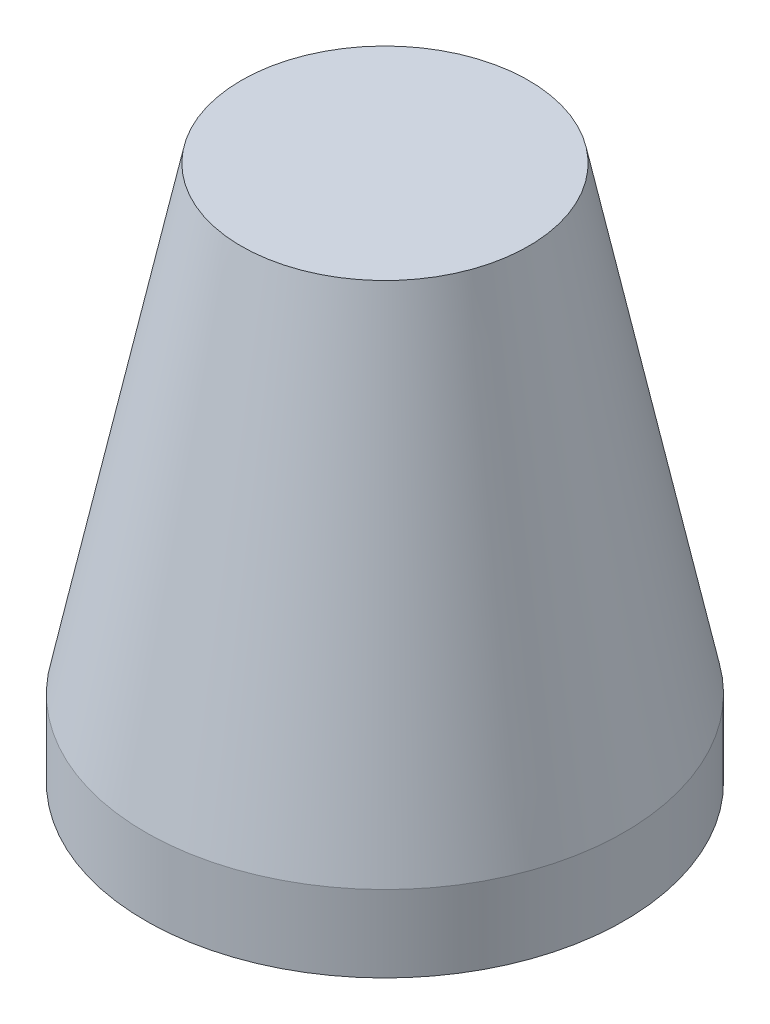
ISO-10303-21;
HEADER;
FILE_DESCRIPTION(('STEP AP214'),'2;1');
FILE_NAME('part.step','',(''),(''),'','','');
FILE_SCHEMA(('AUTOMOTIVE_DESIGN { 1 0 10303 214 1 1 1 1 }'));
ENDSEC;
DATA;
#1=APPLICATION_CONTEXT('core data for automotive mechanical design processes');
#2=APPLICATION_PROTOCOL_DEFINITION('international standard','automotive_design',2000,#1);
#3=PRODUCT_CONTEXT('',#1,'mechanical');
#4=PRODUCT('Part','Part','',(#3));
#5=PRODUCT_RELATED_PRODUCT_CATEGORY('part','',(#4));
#6=PRODUCT_DEFINITION_FORMATION('','',#4);
#7=PRODUCT_DEFINITION_CONTEXT('part definition',#1,'design');
#8=PRODUCT_DEFINITION('design','',#6,#7);
#9=PRODUCT_DEFINITION_SHAPE('','',#8);
#10=(LENGTH_UNIT() NAMED_UNIT(*) SI_UNIT(.MILLI.,.METRE.));
#11=(NAMED_UNIT(*) PLANE_ANGLE_UNIT() SI_UNIT($,.RADIAN.));
#12=(NAMED_UNIT(*) SI_UNIT($,.STERADIAN.) SOLID_ANGLE_UNIT());
#13=UNCERTAINTY_MEASURE_WITH_UNIT(LENGTH_MEASURE(1.E-05),#10,'distance_accuracy_value','');
#14=(GEOMETRIC_REPRESENTATION_CONTEXT(3) GLOBAL_UNCERTAINTY_ASSIGNED_CONTEXT((#13)) GLOBAL_UNIT_ASSIGNED_CONTEXT((#10,
#11,#12)) REPRESENTATION_CONTEXT('',''));
#15=CARTESIAN_POINT('',(0.,0.,0.));
#16=DIRECTION('',(0.,0.,1.));
#17=DIRECTION('',(1.,0.,0.));
#18=AXIS2_PLACEMENT_3D('',#15,#16,#17);
#19=CARTESIAN_POINT('',(-15.,56.,0.));
#20=DIRECTION('',(0.,1.,0.));
#21=DIRECTION('',(-1.,0.,0.));
#22=AXIS2_PLACEMENT_3D('',#19,#20,#21);
#23=PLANE('',#22);
#24=CARTESIAN_POINT('',(0.,56.,0.));
#25=DIRECTION('',(0.,1.,0.));
#26=DIRECTION('',(-1.,0.,0.));
#27=AXIS2_PLACEMENT_3D('',#24,#25,#26);
#28=CIRCLE('',#27,15.);
#29=CARTESIAN_POINT('',(-15.,56.,0.));
#30=VERTEX_POINT('',#29);
#31=EDGE_CURVE('E53',#30,#30,#28,.T.);
#32=ORIENTED_EDGE('',*,*,#31,.T.);
#33=EDGE_LOOP('',(#32));
#34=FACE_BOUND('',#33,.T.);
#35=ADVANCED_FACE('F41',(#34),#23,.T.);
#36=CARTESIAN_POINT('',(0.,0.,0.));
#37=DIRECTION('',(0.,-1.,0.));
#38=DIRECTION('',(1.,0.,0.));
#39=AXIS2_PLACEMENT_3D('',#36,#37,#38);
#40=PLANE('',#39);
#41=CARTESIAN_POINT('',(0.,0.,0.));
#42=DIRECTION('',(0.,1.,0.));
#43=DIRECTION('',(-1.,0.,0.));
#44=AXIS2_PLACEMENT_3D('',#41,#42,#43);
#45=CIRCLE('',#44,25.);
#46=CARTESIAN_POINT('',(-25.,0.,0.));
#47=VERTEX_POINT('',#46);
#48=EDGE_CURVE('E10',#47,#47,#45,.T.);
#49=ORIENTED_EDGE('',*,*,#48,.F.);
#50=EDGE_LOOP('',(#49));
#51=FACE_BOUND('',#50,.T.);
#52=ADVANCED_FACE('F69',(#51),#40,.T.);
#53=CARTESIAN_POINT('',(0.,56.,0.));
#54=DIRECTION('',(0.,1.,0.));
#55=DIRECTION('',(-1.,0.,0.));
#56=AXIS2_PLACEMENT_3D('',#53,#54,#55);
#57=CYLINDRICAL_SURFACE('',#56,25.);
#58=ORIENTED_EDGE('',*,*,#48,.T.);
#59=EDGE_LOOP('',(#58));
#60=FACE_BOUND('',#59,.T.);
#61=CARTESIAN_POINT('',(0.,8.,0.));
#62=DIRECTION('',(0.,1.,0.));
#63=DIRECTION('',(-1.,0.,0.));
#64=AXIS2_PLACEMENT_3D('',#61,#62,#63);
#65=CIRCLE('',#64,25.);
#66=CARTESIAN_POINT('',(-25.,8.,0.));
#67=VERTEX_POINT('',#66);
#68=EDGE_CURVE('E48',#67,#67,#65,.T.);
#69=ORIENTED_EDGE('',*,*,#68,.F.);
#70=EDGE_LOOP('',(#69));
#71=FACE_BOUND('',#70,.T.);
#72=ADVANCED_FACE('F64',(#60,#71),#57,.T.);
#73=CARTESIAN_POINT('',(0.,56.,0.));
#74=DIRECTION('',(0.,-1.,0.));
#75=DIRECTION('',(1.,0.,0.));
#76=AXIS2_PLACEMENT_3D('',#73,#74,#75);
#77=CONICAL_SURFACE('',#76,15.,0.205395389189767);
#78=ORIENTED_EDGE('',*,*,#68,.T.);
#79=EDGE_LOOP('',(#78));
#80=FACE_BOUND('',#79,.T.);
#81=ORIENTED_EDGE('',*,*,#31,.F.);
#82=EDGE_LOOP('',(#81));
#83=FACE_BOUND('',#82,.T.);
#84=ADVANCED_FACE('F62',(#80,#83),#77,.T.);
#85=CLOSED_SHELL('',(#35,#52,#72,#84));
#86=MANIFOLD_SOLID_BREP('B2',#85);
#87=ADVANCED_BREP_SHAPE_REPRESENTATION('',(#18,#86),#14);
#88=SHAPE_DEFINITION_REPRESENTATION(#9,#87);
ENDSEC;
END-ISO-10303-21;
